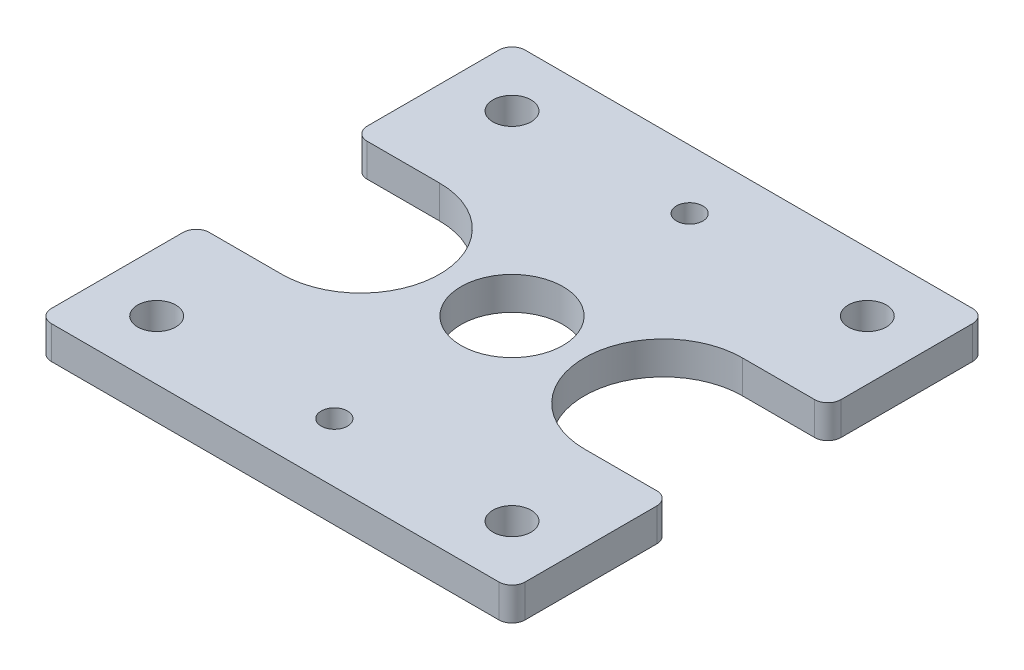
ISO-10303-21;
HEADER;
FILE_DESCRIPTION(('STEP AP214'),'2;1');
FILE_NAME('part.step','',(''),(''),'','','');
FILE_SCHEMA(('AUTOMOTIVE_DESIGN { 1 0 10303 214 1 1 1 1 }'));
ENDSEC;
DATA;
#1=APPLICATION_CONTEXT('core data for automotive mechanical design processes');
#2=APPLICATION_PROTOCOL_DEFINITION('international standard','automotive_design',2000,#1);
#3=PRODUCT_CONTEXT('',#1,'mechanical');
#4=PRODUCT('Part','Part','',(#3));
#5=PRODUCT_RELATED_PRODUCT_CATEGORY('part','',(#4));
#6=PRODUCT_DEFINITION_FORMATION('','',#4);
#7=PRODUCT_DEFINITION_CONTEXT('part definition',#1,'design');
#8=PRODUCT_DEFINITION('design','',#6,#7);
#9=PRODUCT_DEFINITION_SHAPE('','',#8);
#10=(LENGTH_UNIT() NAMED_UNIT(*) SI_UNIT(.MILLI.,.METRE.));
#11=(NAMED_UNIT(*) PLANE_ANGLE_UNIT() SI_UNIT($,.RADIAN.));
#12=(NAMED_UNIT(*) SI_UNIT($,.STERADIAN.) SOLID_ANGLE_UNIT());
#13=UNCERTAINTY_MEASURE_WITH_UNIT(LENGTH_MEASURE(1.E-05),#10,'distance_accuracy_value','');
#14=(GEOMETRIC_REPRESENTATION_CONTEXT(3) GLOBAL_UNCERTAINTY_ASSIGNED_CONTEXT((#13)) GLOBAL_UNIT_ASSIGNED_CONTEXT((#10,
#11,#12)) REPRESENTATION_CONTEXT('',''));
#15=CARTESIAN_POINT('',(0.,0.,0.));
#16=DIRECTION('',(0.,0.,1.));
#17=DIRECTION('',(1.,0.,0.));
#18=AXIS2_PLACEMENT_3D('',#15,#16,#17);
#19=CARTESIAN_POINT('',(-23.,5.,0.));
#20=DIRECTION('',(0.,1.,0.));
#21=DIRECTION('',(0.,0.,1.));
#22=AXIS2_PLACEMENT_3D('',#19,#20,#21);
#23=PLANE('',#22);
#24=CARTESIAN_POINT('',(0.,5.,27.));
#25=DIRECTION('',(0.,1.,0.));
#26=DIRECTION('',(0.,0.,1.));
#27=AXIS2_PLACEMENT_3D('',#24,#25,#26);
#28=CIRCLE('',#27,2.);
#29=CARTESIAN_POINT('',(0.,5.,29.));
#30=VERTEX_POINT('',#29);
#31=EDGE_CURVE('E376',#30,#30,#28,.T.);
#32=ORIENTED_EDGE('',*,*,#31,.F.);
#33=EDGE_LOOP('',(#32));
#34=FACE_BOUND('',#33,.T.);
#35=CARTESIAN_POINT('',(27.,5.,27.));
#36=DIRECTION('',(0.,1.,0.));
#37=DIRECTION('',(0.,0.,1.));
#38=AXIS2_PLACEMENT_3D('',#35,#36,#37);
#39=CIRCLE('',#38,2.9);
#40=CARTESIAN_POINT('',(27.,5.,29.9));
#41=VERTEX_POINT('',#40);
#42=EDGE_CURVE('E364',#41,#41,#39,.T.);
#43=ORIENTED_EDGE('',*,*,#42,.F.);
#44=EDGE_LOOP('',(#43));
#45=FACE_BOUND('',#44,.T.);
#46=CARTESIAN_POINT('',(-27.,5.,-27.));
#47=DIRECTION('',(0.,1.,0.));
#48=DIRECTION('',(0.,0.,1.));
#49=AXIS2_PLACEMENT_3D('',#46,#47,#48);
#50=CIRCLE('',#49,2.9);
#51=CARTESIAN_POINT('',(-27.,5.,-24.1));
#52=VERTEX_POINT('',#51);
#53=EDGE_CURVE('E352',#52,#52,#50,.T.);
#54=ORIENTED_EDGE('',*,*,#53,.F.);
#55=EDGE_LOOP('',(#54));
#56=FACE_BOUND('',#55,.T.);
#57=DIRECTION('',(0.,0.,1.));
#58=VECTOR('',#57,1.);
#59=CARTESIAN_POINT('',(-36.,5.,-12.));
#60=LINE('',#59,#58);
#61=CARTESIAN_POINT('',(-36.,5.,-34.));
#62=VERTEX_POINT('',#61);
#63=CARTESIAN_POINT('',(-36.,5.,-14.));
#64=VERTEX_POINT('',#63);
#65=EDGE_CURVE('E185',#62,#64,#60,.T.);
#66=ORIENTED_EDGE('',*,*,#65,.T.);
#67=CARTESIAN_POINT('',(-34.,5.,-14.));
#68=DIRECTION('',(0.,1.,0.));
#69=DIRECTION('',(0.,0.,1.));
#70=AXIS2_PLACEMENT_3D('',#67,#68,#69);
#71=CIRCLE('',#70,2.);
#72=CARTESIAN_POINT('',(-34.,5.,-12.));
#73=VERTEX_POINT('',#72);
#74=EDGE_CURVE('E181',#64,#73,#71,.T.);
#75=ORIENTED_EDGE('',*,*,#74,.T.);
#76=DIRECTION('',(1.,0.,0.));
#77=VECTOR('',#76,1.);
#78=CARTESIAN_POINT('',(-23.,5.,-12.));
#79=LINE('',#78,#77);
#80=CARTESIAN_POINT('',(-23.,5.,-12.));
#81=VERTEX_POINT('',#80);
#82=EDGE_CURVE('E172',#73,#81,#79,.T.);
#83=ORIENTED_EDGE('',*,*,#82,.T.);
#84=CARTESIAN_POINT('',(-23.,5.,0.));
#85=DIRECTION('',(0.,-1.,0.));
#86=DIRECTION('',(0.,0.,1.));
#87=AXIS2_PLACEMENT_3D('',#84,#85,#86);
#88=CIRCLE('',#87,12.);
#89=CARTESIAN_POINT('',(-23.,5.,12.));
#90=VERTEX_POINT('',#89);
#91=EDGE_CURVE('E178',#81,#90,#88,.T.);
#92=ORIENTED_EDGE('',*,*,#91,.T.);
#93=DIRECTION('',(-1.,0.,0.));
#94=VECTOR('',#93,1.);
#95=CARTESIAN_POINT('',(-23.,5.,12.));
#96=LINE('',#95,#94);
#97=CARTESIAN_POINT('',(-34.,5.,12.));
#98=VERTEX_POINT('',#97);
#99=EDGE_CURVE('E200',#90,#98,#96,.T.);
#100=ORIENTED_EDGE('',*,*,#99,.T.);
#101=CARTESIAN_POINT('',(-34.,5.,14.));
#102=DIRECTION('',(0.,1.,0.));
#103=DIRECTION('',(0.,0.,1.));
#104=AXIS2_PLACEMENT_3D('',#101,#102,#103);
#105=CIRCLE('',#104,2.);
#106=CARTESIAN_POINT('',(-36.,5.,14.));
#107=VERTEX_POINT('',#106);
#108=EDGE_CURVE('E309',#98,#107,#105,.T.);
#109=ORIENTED_EDGE('',*,*,#108,.T.);
#110=DIRECTION('',(0.,0.,1.));
#111=VECTOR('',#110,1.);
#112=CARTESIAN_POINT('',(-36.,5.,36.));
#113=LINE('',#112,#111);
#114=CARTESIAN_POINT('',(-36.,5.,34.));
#115=VERTEX_POINT('',#114);
#116=EDGE_CURVE('E202',#107,#115,#113,.T.);
#117=ORIENTED_EDGE('',*,*,#116,.T.);
#118=CARTESIAN_POINT('',(-34.,5.,34.));
#119=DIRECTION('',(0.,1.,0.));
#120=DIRECTION('',(0.,0.,1.));
#121=AXIS2_PLACEMENT_3D('',#118,#119,#120);
#122=CIRCLE('',#121,2.);
#123=CARTESIAN_POINT('',(-34.,5.,36.));
#124=VERTEX_POINT('',#123);
#125=EDGE_CURVE('E272',#115,#124,#122,.T.);
#126=ORIENTED_EDGE('',*,*,#125,.T.);
#127=DIRECTION('',(1.,0.,0.));
#128=VECTOR('',#127,1.);
#129=CARTESIAN_POINT('',(-36.,5.,36.));
#130=LINE('',#129,#128);
#131=CARTESIAN_POINT('',(34.,5.,36.));
#132=VERTEX_POINT('',#131);
#133=EDGE_CURVE('E207',#124,#132,#130,.T.);
#134=ORIENTED_EDGE('',*,*,#133,.T.);
#135=CARTESIAN_POINT('',(34.,5.,34.));
#136=DIRECTION('',(0.,1.,0.));
#137=DIRECTION('',(0.,0.,1.));
#138=AXIS2_PLACEMENT_3D('',#135,#136,#137);
#139=CIRCLE('',#138,2.);
#140=CARTESIAN_POINT('',(36.,5.,34.));
#141=VERTEX_POINT('',#140);
#142=EDGE_CURVE('E274',#132,#141,#139,.T.);
#143=ORIENTED_EDGE('',*,*,#142,.T.);
#144=DIRECTION('',(0.,0.,-1.));
#145=VECTOR('',#144,1.);
#146=CARTESIAN_POINT('',(36.,5.,36.));
#147=LINE('',#146,#145);
#148=CARTESIAN_POINT('',(36.,5.,14.));
#149=VERTEX_POINT('',#148);
#150=EDGE_CURVE('E210',#141,#149,#147,.T.);
#151=ORIENTED_EDGE('',*,*,#150,.T.);
#152=CARTESIAN_POINT('',(34.,5.,14.));
#153=DIRECTION('',(0.,1.,0.));
#154=DIRECTION('',(0.,0.,1.));
#155=AXIS2_PLACEMENT_3D('',#152,#153,#154);
#156=CIRCLE('',#155,2.);
#157=CARTESIAN_POINT('',(34.,5.,12.));
#158=VERTEX_POINT('',#157);
#159=EDGE_CURVE('E57',#149,#158,#156,.T.);
#160=ORIENTED_EDGE('',*,*,#159,.T.);
#161=DIRECTION('',(-1.,0.,0.));
#162=VECTOR('',#161,1.);
#163=CARTESIAN_POINT('',(23.,5.,12.));
#164=LINE('',#163,#162);
#165=CARTESIAN_POINT('',(23.,5.,12.));
#166=VERTEX_POINT('',#165);
#167=EDGE_CURVE('E212',#158,#166,#164,.T.);
#168=ORIENTED_EDGE('',*,*,#167,.T.);
#169=CARTESIAN_POINT('',(23.,5.,0.));
#170=DIRECTION('',(0.,-1.,0.));
#171=DIRECTION('',(0.,0.,1.));
#172=AXIS2_PLACEMENT_3D('',#169,#170,#171);
#173=CIRCLE('',#172,12.);
#174=CARTESIAN_POINT('',(23.,5.,-12.));
#175=VERTEX_POINT('',#174);
#176=EDGE_CURVE('E214',#166,#175,#173,.T.);
#177=ORIENTED_EDGE('',*,*,#176,.T.);
#178=DIRECTION('',(1.,0.,0.));
#179=VECTOR('',#178,1.);
#180=CARTESIAN_POINT('',(23.,5.,-12.));
#181=LINE('',#180,#179);
#182=CARTESIAN_POINT('',(34.,5.,-12.));
#183=VERTEX_POINT('',#182);
#184=EDGE_CURVE('E216',#175,#183,#181,.T.);
#185=ORIENTED_EDGE('',*,*,#184,.T.);
#186=CARTESIAN_POINT('',(34.,5.,-14.));
#187=DIRECTION('',(0.,1.,0.));
#188=DIRECTION('',(0.,0.,1.));
#189=AXIS2_PLACEMENT_3D('',#186,#187,#188);
#190=CIRCLE('',#189,2.);
#191=CARTESIAN_POINT('',(36.,5.,-14.));
#192=VERTEX_POINT('',#191);
#193=EDGE_CURVE('E306',#183,#192,#190,.T.);
#194=ORIENTED_EDGE('',*,*,#193,.T.);
#195=DIRECTION('',(0.,0.,-1.));
#196=VECTOR('',#195,1.);
#197=CARTESIAN_POINT('',(36.,5.,-12.));
#198=LINE('',#197,#196);
#199=CARTESIAN_POINT('',(36.,5.,-34.));
#200=VERTEX_POINT('',#199);
#201=EDGE_CURVE('E248',#192,#200,#198,.T.);
#202=ORIENTED_EDGE('',*,*,#201,.T.);
#203=CARTESIAN_POINT('',(34.,5.,-34.));
#204=DIRECTION('',(0.,1.,0.));
#205=DIRECTION('',(0.,0.,1.));
#206=AXIS2_PLACEMENT_3D('',#203,#204,#205);
#207=CIRCLE('',#206,2.);
#208=CARTESIAN_POINT('',(34.,5.,-36.));
#209=VERTEX_POINT('',#208);
#210=EDGE_CURVE('E278',#200,#209,#207,.T.);
#211=ORIENTED_EDGE('',*,*,#210,.T.);
#212=DIRECTION('',(-1.,0.,0.));
#213=VECTOR('',#212,1.);
#214=CARTESIAN_POINT('',(-36.,5.,-36.));
#215=LINE('',#214,#213);
#216=CARTESIAN_POINT('',(-34.,5.,-36.));
#217=VERTEX_POINT('',#216);
#218=EDGE_CURVE('E341',#209,#217,#215,.T.);
#219=ORIENTED_EDGE('',*,*,#218,.T.);
#220=CARTESIAN_POINT('',(-34.,5.,-34.));
#221=DIRECTION('',(0.,1.,0.));
#222=DIRECTION('',(0.,0.,1.));
#223=AXIS2_PLACEMENT_3D('',#220,#221,#222);
#224=CIRCLE('',#223,2.);
#225=EDGE_CURVE('E276',#217,#62,#224,.T.);
#226=ORIENTED_EDGE('',*,*,#225,.T.);
#227=EDGE_LOOP('',(#66,#75,#83,#92,#100,#109,#117,#126,#134,#143,#151,#160,#168,#177,#185,#194,
#202,#211,#219,#226));
#228=FACE_BOUND('',#227,.T.);
#229=CARTESIAN_POINT('',(0.,5.,0.));
#230=DIRECTION('',(0.,1.,0.));
#231=DIRECTION('',(0.,0.,1.));
#232=AXIS2_PLACEMENT_3D('',#229,#230,#231);
#233=CIRCLE('',#232,7.75);
#234=CARTESIAN_POINT('',(0.,5.,7.75));
#235=VERTEX_POINT('',#234);
#236=EDGE_CURVE('E222',#235,#235,#233,.T.);
#237=ORIENTED_EDGE('',*,*,#236,.F.);
#238=EDGE_LOOP('',(#237));
#239=FACE_BOUND('',#238,.T.);
#240=CARTESIAN_POINT('',(27.,5.,-27.0000000000001));
#241=DIRECTION('',(0.,1.,0.));
#242=DIRECTION('',(0.,0.,1.));
#243=AXIS2_PLACEMENT_3D('',#240,#241,#242);
#244=CIRCLE('',#243,2.9);
#245=CARTESIAN_POINT('',(27.,5.,-24.1000000000001));
#246=VERTEX_POINT('',#245);
#247=EDGE_CURVE('E358',#246,#246,#244,.T.);
#248=ORIENTED_EDGE('',*,*,#247,.F.);
#249=EDGE_LOOP('',(#248));
#250=FACE_BOUND('',#249,.T.);
#251=CARTESIAN_POINT('',(-27.,5.,27.));
#252=DIRECTION('',(0.,1.,0.));
#253=DIRECTION('',(0.,0.,1.));
#254=AXIS2_PLACEMENT_3D('',#251,#252,#253);
#255=CIRCLE('',#254,2.9);
#256=CARTESIAN_POINT('',(-27.,5.,29.9));
#257=VERTEX_POINT('',#256);
#258=EDGE_CURVE('E370',#257,#257,#255,.T.);
#259=ORIENTED_EDGE('',*,*,#258,.F.);
#260=EDGE_LOOP('',(#259));
#261=FACE_BOUND('',#260,.T.);
#262=CARTESIAN_POINT('',(0.,5.,-27.0000000000001));
#263=DIRECTION('',(0.,1.,0.));
#264=DIRECTION('',(0.,0.,1.));
#265=AXIS2_PLACEMENT_3D('',#262,#263,#264);
#266=CIRCLE('',#265,2.);
#267=CARTESIAN_POINT('',(0.,5.,-25.));
#268=VERTEX_POINT('',#267);
#269=EDGE_CURVE('E382',#268,#268,#266,.T.);
#270=ORIENTED_EDGE('',*,*,#269,.F.);
#271=EDGE_LOOP('',(#270));
#272=FACE_BOUND('',#271,.T.);
#273=ADVANCED_FACE('F36',(#34,#45,#56,#228,#239,#250,#261,#272),#23,.T.);
#274=CARTESIAN_POINT('',(-23.,0.,0.));
#275=DIRECTION('',(0.,1.,0.));
#276=DIRECTION('',(0.,0.,1.));
#277=AXIS2_PLACEMENT_3D('',#274,#275,#276);
#278=PLANE('',#277);
#279=DIRECTION('',(1.,0.,0.));
#280=VECTOR('',#279,1.);
#281=CARTESIAN_POINT('',(-23.,0.,-12.));
#282=LINE('',#281,#280);
#283=CARTESIAN_POINT('',(-34.,0.,-12.));
#284=VERTEX_POINT('',#283);
#285=CARTESIAN_POINT('',(-23.,0.,-12.));
#286=VERTEX_POINT('',#285);
#287=EDGE_CURVE('E191',#284,#286,#282,.T.);
#288=ORIENTED_EDGE('',*,*,#287,.F.);
#289=CARTESIAN_POINT('',(-34.,0.,-14.));
#290=DIRECTION('',(0.,1.,0.));
#291=DIRECTION('',(0.,0.,1.));
#292=AXIS2_PLACEMENT_3D('',#289,#290,#291);
#293=CIRCLE('',#292,2.);
#294=CARTESIAN_POINT('',(-36.,0.,-14.));
#295=VERTEX_POINT('',#294);
#296=EDGE_CURVE('E302',#284,#295,#293,.F.);
#297=ORIENTED_EDGE('',*,*,#296,.T.);
#298=DIRECTION('',(0.,0.,1.));
#299=VECTOR('',#298,1.);
#300=CARTESIAN_POINT('',(-36.,0.,-12.));
#301=LINE('',#300,#299);
#302=CARTESIAN_POINT('',(-36.,0.,-34.));
#303=VERTEX_POINT('',#302);
#304=EDGE_CURVE('E225',#303,#295,#301,.T.);
#305=ORIENTED_EDGE('',*,*,#304,.F.);
#306=CARTESIAN_POINT('',(-34.,0.,-34.));
#307=DIRECTION('',(0.,1.,0.));
#308=DIRECTION('',(0.,0.,1.));
#309=AXIS2_PLACEMENT_3D('',#306,#307,#308);
#310=CIRCLE('',#309,2.);
#311=CARTESIAN_POINT('',(-34.,0.,-36.));
#312=VERTEX_POINT('',#311);
#313=EDGE_CURVE('E264',#303,#312,#310,.F.);
#314=ORIENTED_EDGE('',*,*,#313,.T.);
#315=DIRECTION('',(-1.,0.,0.));
#316=VECTOR('',#315,1.);
#317=CARTESIAN_POINT('',(-36.,0.,-36.));
#318=LINE('',#317,#316);
#319=CARTESIAN_POINT('',(34.,0.,-36.));
#320=VERTEX_POINT('',#319);
#321=EDGE_CURVE('E221',#320,#312,#318,.T.);
#322=ORIENTED_EDGE('',*,*,#321,.F.);
#323=CARTESIAN_POINT('',(34.,0.,-34.));
#324=DIRECTION('',(0.,1.,0.));
#325=DIRECTION('',(0.,0.,1.));
#326=AXIS2_PLACEMENT_3D('',#323,#324,#325);
#327=CIRCLE('',#326,2.);
#328=CARTESIAN_POINT('',(36.,0.,-34.));
#329=VERTEX_POINT('',#328);
#330=EDGE_CURVE('E266',#320,#329,#327,.F.);
#331=ORIENTED_EDGE('',*,*,#330,.T.);
#332=DIRECTION('',(0.,0.,-1.));
#333=VECTOR('',#332,1.);
#334=CARTESIAN_POINT('',(36.,0.,-12.));
#335=LINE('',#334,#333);
#336=CARTESIAN_POINT('',(36.,0.,-14.));
#337=VERTEX_POINT('',#336);
#338=EDGE_CURVE('E219',#337,#329,#335,.T.);
#339=ORIENTED_EDGE('',*,*,#338,.F.);
#340=CARTESIAN_POINT('',(34.,0.,-14.));
#341=DIRECTION('',(0.,1.,0.));
#342=DIRECTION('',(0.,0.,1.));
#343=AXIS2_PLACEMENT_3D('',#340,#341,#342);
#344=CIRCLE('',#343,2.);
#345=CARTESIAN_POINT('',(34.,0.,-12.));
#346=VERTEX_POINT('',#345);
#347=EDGE_CURVE('E296',#337,#346,#344,.F.);
#348=ORIENTED_EDGE('',*,*,#347,.T.);
#349=DIRECTION('',(1.,0.,0.));
#350=VECTOR('',#349,1.);
#351=CARTESIAN_POINT('',(23.,0.,-12.));
#352=LINE('',#351,#350);
#353=CARTESIAN_POINT('',(23.,0.,-12.));
#354=VERTEX_POINT('',#353);
#355=EDGE_CURVE('E246',#354,#346,#352,.T.);
#356=ORIENTED_EDGE('',*,*,#355,.F.);
#357=CARTESIAN_POINT('',(23.,0.,0.));
#358=DIRECTION('',(0.,-1.,0.));
#359=DIRECTION('',(0.,0.,1.));
#360=AXIS2_PLACEMENT_3D('',#357,#358,#359);
#361=CIRCLE('',#360,12.);
#362=CARTESIAN_POINT('',(23.,0.,12.));
#363=VERTEX_POINT('',#362);
#364=EDGE_CURVE('E244',#363,#354,#361,.T.);
#365=ORIENTED_EDGE('',*,*,#364,.F.);
#366=DIRECTION('',(-1.,0.,0.));
#367=VECTOR('',#366,1.);
#368=CARTESIAN_POINT('',(23.,0.,12.));
#369=LINE('',#368,#367);
#370=CARTESIAN_POINT('',(34.,0.,12.));
#371=VERTEX_POINT('',#370);
#372=EDGE_CURVE('E242',#371,#363,#369,.T.);
#373=ORIENTED_EDGE('',*,*,#372,.F.);
#374=CARTESIAN_POINT('',(34.,0.,14.));
#375=DIRECTION('',(0.,1.,0.));
#376=DIRECTION('',(0.,0.,1.));
#377=AXIS2_PLACEMENT_3D('',#374,#375,#376);
#378=CIRCLE('',#377,2.);
#379=CARTESIAN_POINT('',(36.,0.,14.));
#380=VERTEX_POINT('',#379);
#381=EDGE_CURVE('E298',#371,#380,#378,.F.);
#382=ORIENTED_EDGE('',*,*,#381,.T.);
#383=DIRECTION('',(0.,0.,-1.));
#384=VECTOR('',#383,1.);
#385=CARTESIAN_POINT('',(36.,0.,36.));
#386=LINE('',#385,#384);
#387=CARTESIAN_POINT('',(36.,0.,34.));
#388=VERTEX_POINT('',#387);
#389=EDGE_CURVE('E239',#388,#380,#386,.T.);
#390=ORIENTED_EDGE('',*,*,#389,.F.);
#391=CARTESIAN_POINT('',(34.,0.,34.));
#392=DIRECTION('',(0.,1.,0.));
#393=DIRECTION('',(0.,0.,1.));
#394=AXIS2_PLACEMENT_3D('',#391,#392,#393);
#395=CIRCLE('',#394,2.);
#396=CARTESIAN_POINT('',(34.,0.,36.));
#397=VERTEX_POINT('',#396);
#398=EDGE_CURVE('E262',#388,#397,#395,.F.);
#399=ORIENTED_EDGE('',*,*,#398,.T.);
#400=DIRECTION('',(1.,0.,0.));
#401=VECTOR('',#400,1.);
#402=CARTESIAN_POINT('',(-36.,0.,36.));
#403=LINE('',#402,#401);
#404=CARTESIAN_POINT('',(-34.,0.,36.));
#405=VERTEX_POINT('',#404);
#406=EDGE_CURVE('E236',#405,#397,#403,.T.);
#407=ORIENTED_EDGE('',*,*,#406,.F.);
#408=CARTESIAN_POINT('',(-34.,0.,34.));
#409=DIRECTION('',(0.,1.,0.));
#410=DIRECTION('',(0.,0.,1.));
#411=AXIS2_PLACEMENT_3D('',#408,#409,#410);
#412=CIRCLE('',#411,2.);
#413=CARTESIAN_POINT('',(-36.,0.,34.));
#414=VERTEX_POINT('',#413);
#415=EDGE_CURVE('E259',#405,#414,#412,.F.);
#416=ORIENTED_EDGE('',*,*,#415,.T.);
#417=DIRECTION('',(0.,0.,1.));
#418=VECTOR('',#417,1.);
#419=CARTESIAN_POINT('',(-36.,0.,36.));
#420=LINE('',#419,#418);
#421=CARTESIAN_POINT('',(-36.,0.,14.));
#422=VERTEX_POINT('',#421);
#423=EDGE_CURVE('E234',#422,#414,#420,.T.);
#424=ORIENTED_EDGE('',*,*,#423,.F.);
#425=CARTESIAN_POINT('',(-34.,0.,14.));
#426=DIRECTION('',(0.,1.,0.));
#427=DIRECTION('',(0.,0.,1.));
#428=AXIS2_PLACEMENT_3D('',#425,#426,#427);
#429=CIRCLE('',#428,2.);
#430=CARTESIAN_POINT('',(-34.,0.,12.));
#431=VERTEX_POINT('',#430);
#432=EDGE_CURVE('E300',#422,#431,#429,.F.);
#433=ORIENTED_EDGE('',*,*,#432,.T.);
#434=DIRECTION('',(-1.,0.,0.));
#435=VECTOR('',#434,1.);
#436=CARTESIAN_POINT('',(-23.,0.,12.));
#437=LINE('',#436,#435);
#438=CARTESIAN_POINT('',(-23.,0.,12.));
#439=VERTEX_POINT('',#438);
#440=EDGE_CURVE('E231',#439,#431,#437,.T.);
#441=ORIENTED_EDGE('',*,*,#440,.F.);
#442=CARTESIAN_POINT('',(-23.,0.,0.));
#443=DIRECTION('',(0.,-1.,0.));
#444=DIRECTION('',(0.,0.,1.));
#445=AXIS2_PLACEMENT_3D('',#442,#443,#444);
#446=CIRCLE('',#445,12.);
#447=EDGE_CURVE('E229',#286,#439,#446,.T.);
#448=ORIENTED_EDGE('',*,*,#447,.F.);
#449=EDGE_LOOP('',(#288,#297,#305,#314,#322,#331,#339,#348,#356,#365,#373,#382,#390,#399,#407,
#416,#424,#433,#441,#448));
#450=FACE_BOUND('',#449,.T.);
#451=CARTESIAN_POINT('',(0.,0.,0.));
#452=DIRECTION('',(0.,1.,0.));
#453=DIRECTION('',(0.,0.,1.));
#454=AXIS2_PLACEMENT_3D('',#451,#452,#453);
#455=CIRCLE('',#454,7.75);
#456=CARTESIAN_POINT('',(0.,0.,7.75));
#457=VERTEX_POINT('',#456);
#458=EDGE_CURVE('E349',#457,#457,#455,.T.);
#459=ORIENTED_EDGE('',*,*,#458,.T.);
#460=EDGE_LOOP('',(#459));
#461=FACE_BOUND('',#460,.T.);
#462=CARTESIAN_POINT('',(-27.,0.,-27.));
#463=DIRECTION('',(0.,1.,0.));
#464=DIRECTION('',(0.,0.,1.));
#465=AXIS2_PLACEMENT_3D('',#462,#463,#464);
#466=CIRCLE('',#465,2.9);
#467=CARTESIAN_POINT('',(-27.,0.,-24.1));
#468=VERTEX_POINT('',#467);
#469=EDGE_CURVE('E355',#468,#468,#466,.T.);
#470=ORIENTED_EDGE('',*,*,#469,.T.);
#471=EDGE_LOOP('',(#470));
#472=FACE_BOUND('',#471,.T.);
#473=CARTESIAN_POINT('',(27.,0.,-27.0000000000001));
#474=DIRECTION('',(0.,1.,0.));
#475=DIRECTION('',(0.,0.,1.));
#476=AXIS2_PLACEMENT_3D('',#473,#474,#475);
#477=CIRCLE('',#476,2.9);
#478=CARTESIAN_POINT('',(27.,0.,-24.1000000000001));
#479=VERTEX_POINT('',#478);
#480=EDGE_CURVE('E361',#479,#479,#477,.T.);
#481=ORIENTED_EDGE('',*,*,#480,.T.);
#482=EDGE_LOOP('',(#481));
#483=FACE_BOUND('',#482,.T.);
#484=CARTESIAN_POINT('',(27.,0.,27.));
#485=DIRECTION('',(0.,1.,0.));
#486=DIRECTION('',(0.,0.,1.));
#487=AXIS2_PLACEMENT_3D('',#484,#485,#486);
#488=CIRCLE('',#487,2.9);
#489=CARTESIAN_POINT('',(27.,0.,29.9));
#490=VERTEX_POINT('',#489);
#491=EDGE_CURVE('E367',#490,#490,#488,.T.);
#492=ORIENTED_EDGE('',*,*,#491,.T.);
#493=EDGE_LOOP('',(#492));
#494=FACE_BOUND('',#493,.T.);
#495=CARTESIAN_POINT('',(-27.,0.,27.));
#496=DIRECTION('',(0.,1.,0.));
#497=DIRECTION('',(0.,0.,1.));
#498=AXIS2_PLACEMENT_3D('',#495,#496,#497);
#499=CIRCLE('',#498,2.9);
#500=CARTESIAN_POINT('',(-27.,0.,29.9));
#501=VERTEX_POINT('',#500);
#502=EDGE_CURVE('E373',#501,#501,#499,.T.);
#503=ORIENTED_EDGE('',*,*,#502,.T.);
#504=EDGE_LOOP('',(#503));
#505=FACE_BOUND('',#504,.T.);
#506=CARTESIAN_POINT('',(0.,0.,27.));
#507=DIRECTION('',(0.,1.,0.));
#508=DIRECTION('',(0.,0.,1.));
#509=AXIS2_PLACEMENT_3D('',#506,#507,#508);
#510=CIRCLE('',#509,2.);
#511=CARTESIAN_POINT('',(0.,0.,29.));
#512=VERTEX_POINT('',#511);
#513=EDGE_CURVE('E379',#512,#512,#510,.T.);
#514=ORIENTED_EDGE('',*,*,#513,.T.);
#515=EDGE_LOOP('',(#514));
#516=FACE_BOUND('',#515,.T.);
#517=CARTESIAN_POINT('',(0.,0.,-27.0000000000001));
#518=DIRECTION('',(0.,1.,0.));
#519=DIRECTION('',(0.,0.,1.));
#520=AXIS2_PLACEMENT_3D('',#517,#518,#519);
#521=CIRCLE('',#520,2.);
#522=CARTESIAN_POINT('',(0.,0.,-25.));
#523=VERTEX_POINT('',#522);
#524=EDGE_CURVE('E385',#523,#523,#521,.T.);
#525=ORIENTED_EDGE('',*,*,#524,.T.);
#526=EDGE_LOOP('',(#525));
#527=FACE_BOUND('',#526,.T.);
#528=ADVANCED_FACE('F330',(#450,#461,#472,#483,#494,#505,#516,#527),#278,.F.);
#529=CARTESIAN_POINT('',(36.,5.,-12.));
#530=DIRECTION('',(-1.,0.,0.));
#531=DIRECTION('',(0.,0.,1.));
#532=AXIS2_PLACEMENT_3D('',#529,#530,#531);
#533=PLANE('',#532);
#534=ORIENTED_EDGE('',*,*,#201,.F.);
#535=DIRECTION('',(0.,-1.,0.));
#536=VECTOR('',#535,1.);
#537=CARTESIAN_POINT('',(36.,5.,-14.));
#538=LINE('',#537,#536);
#539=EDGE_CURVE('E44',#192,#337,#538,.T.);
#540=ORIENTED_EDGE('',*,*,#539,.T.);
#541=ORIENTED_EDGE('',*,*,#338,.T.);
#542=DIRECTION('',(0.,-1.,0.));
#543=VECTOR('',#542,1.);
#544=CARTESIAN_POINT('',(36.,5.,-34.));
#545=LINE('',#544,#543);
#546=EDGE_CURVE('E269',#329,#200,#545,.F.);
#547=ORIENTED_EDGE('',*,*,#546,.T.);
#548=EDGE_LOOP('',(#534,#540,#541,#547));
#549=FACE_BOUND('',#548,.T.);
#550=ADVANCED_FACE('F326',(#549),#533,.F.);
#551=CARTESIAN_POINT('',(-36.,5.,-36.));
#552=DIRECTION('',(0.,0.,1.));
#553=DIRECTION('',(1.,0.,0.));
#554=AXIS2_PLACEMENT_3D('',#551,#552,#553);
#555=PLANE('',#554);
#556=ORIENTED_EDGE('',*,*,#218,.F.);
#557=DIRECTION('',(0.,-1.,0.));
#558=VECTOR('',#557,1.);
#559=CARTESIAN_POINT('',(34.,5.,-36.));
#560=LINE('',#559,#558);
#561=EDGE_CURVE('E256',#209,#320,#560,.T.);
#562=ORIENTED_EDGE('',*,*,#561,.T.);
#563=ORIENTED_EDGE('',*,*,#321,.T.);
#564=DIRECTION('',(0.,-1.,0.));
#565=VECTOR('',#564,1.);
#566=CARTESIAN_POINT('',(-34.,5.,-36.));
#567=LINE('',#566,#565);
#568=EDGE_CURVE('E194',#312,#217,#567,.F.);
#569=ORIENTED_EDGE('',*,*,#568,.T.);
#570=EDGE_LOOP('',(#556,#562,#563,#569));
#571=FACE_BOUND('',#570,.T.);
#572=ADVANCED_FACE('F344',(#571),#555,.F.);
#573=CARTESIAN_POINT('',(-36.,5.,-12.));
#574=DIRECTION('',(1.,0.,0.));
#575=DIRECTION('',(0.,0.,-1.));
#576=AXIS2_PLACEMENT_3D('',#573,#574,#575);
#577=PLANE('',#576);
#578=ORIENTED_EDGE('',*,*,#304,.T.);
#579=DIRECTION('',(0.,-1.,0.));
#580=VECTOR('',#579,1.);
#581=CARTESIAN_POINT('',(-36.,5.,-14.));
#582=LINE('',#581,#580);
#583=EDGE_CURVE('E304',#295,#64,#582,.F.);
#584=ORIENTED_EDGE('',*,*,#583,.T.);
#585=ORIENTED_EDGE('',*,*,#65,.F.);
#586=DIRECTION('',(0.,-1.,0.));
#587=VECTOR('',#586,1.);
#588=CARTESIAN_POINT('',(-36.,5.,-34.));
#589=LINE('',#588,#587);
#590=EDGE_CURVE('E280',#62,#303,#589,.T.);
#591=ORIENTED_EDGE('',*,*,#590,.T.);
#592=EDGE_LOOP('',(#578,#584,#585,#591));
#593=FACE_BOUND('',#592,.T.);
#594=ADVANCED_FACE('F438',(#593),#577,.F.);
#595=CARTESIAN_POINT('',(-23.,5.,-12.));
#596=DIRECTION('',(0.,0.,-1.));
#597=DIRECTION('',(-1.,0.,0.));
#598=AXIS2_PLACEMENT_3D('',#595,#596,#597);
#599=PLANE('',#598);
#600=ORIENTED_EDGE('',*,*,#82,.F.);
#601=DIRECTION('',(0.,-1.,0.));
#602=VECTOR('',#601,1.);
#603=CARTESIAN_POINT('',(-34.,5.,-12.));
#604=LINE('',#603,#602);
#605=EDGE_CURVE('E294',#73,#284,#604,.T.);
#606=ORIENTED_EDGE('',*,*,#605,.T.);
#607=ORIENTED_EDGE('',*,*,#287,.T.);
#608=DIRECTION('',(0.,-1.,0.));
#609=VECTOR('',#608,1.);
#610=CARTESIAN_POINT('',(-23.,5.,-12.));
#611=LINE('',#610,#609);
#612=EDGE_CURVE('E188',#81,#286,#611,.T.);
#613=ORIENTED_EDGE('',*,*,#612,.F.);
#614=EDGE_LOOP('',(#600,#606,#607,#613));
#615=FACE_BOUND('',#614,.T.);
#616=ADVANCED_FACE('F189',(#615),#599,.F.);
#617=CARTESIAN_POINT('',(-23.,5.,0.));
#618=DIRECTION('',(0.,-1.,0.));
#619=DIRECTION('',(0.,0.,-1.));
#620=AXIS2_PLACEMENT_3D('',#617,#618,#619);
#621=CYLINDRICAL_SURFACE('',#620,12.);
#622=ORIENTED_EDGE('',*,*,#447,.T.);
#623=DIRECTION('',(0.,-1.,0.));
#624=VECTOR('',#623,1.);
#625=CARTESIAN_POINT('',(-23.,5.,12.));
#626=LINE('',#625,#624);
#627=EDGE_CURVE('E195',#90,#439,#626,.T.);
#628=ORIENTED_EDGE('',*,*,#627,.F.);
#629=ORIENTED_EDGE('',*,*,#91,.F.);
#630=ORIENTED_EDGE('',*,*,#612,.T.);
#631=EDGE_LOOP('',(#622,#628,#629,#630));
#632=FACE_BOUND('',#631,.T.);
#633=ADVANCED_FACE('F197',(#632),#621,.F.);
#634=CARTESIAN_POINT('',(-23.,5.,12.));
#635=DIRECTION('',(0.,0.,1.));
#636=DIRECTION('',(1.,0.,0.));
#637=AXIS2_PLACEMENT_3D('',#634,#635,#636);
#638=PLANE('',#637);
#639=ORIENTED_EDGE('',*,*,#440,.T.);
#640=DIRECTION('',(0.,-1.,0.));
#641=VECTOR('',#640,1.);
#642=CARTESIAN_POINT('',(-34.,5.,12.));
#643=LINE('',#642,#641);
#644=EDGE_CURVE('E315',#431,#98,#643,.F.);
#645=ORIENTED_EDGE('',*,*,#644,.T.);
#646=ORIENTED_EDGE('',*,*,#99,.F.);
#647=ORIENTED_EDGE('',*,*,#627,.T.);
#648=EDGE_LOOP('',(#639,#645,#646,#647));
#649=FACE_BOUND('',#648,.T.);
#650=ADVANCED_FACE('F429',(#649),#638,.F.);
#651=CARTESIAN_POINT('',(-36.,5.,36.));
#652=DIRECTION('',(1.,0.,0.));
#653=DIRECTION('',(0.,0.,-1.));
#654=AXIS2_PLACEMENT_3D('',#651,#652,#653);
#655=PLANE('',#654);
#656=ORIENTED_EDGE('',*,*,#116,.F.);
#657=DIRECTION('',(0.,-1.,0.));
#658=VECTOR('',#657,1.);
#659=CARTESIAN_POINT('',(-36.,5.,14.));
#660=LINE('',#659,#658);
#661=EDGE_CURVE('E312',#107,#422,#660,.T.);
#662=ORIENTED_EDGE('',*,*,#661,.T.);
#663=ORIENTED_EDGE('',*,*,#423,.T.);
#664=DIRECTION('',(0.,-1.,0.));
#665=VECTOR('',#664,1.);
#666=CARTESIAN_POINT('',(-36.,5.,34.));
#667=LINE('',#666,#665);
#668=EDGE_CURVE('E291',#414,#115,#667,.F.);
#669=ORIENTED_EDGE('',*,*,#668,.T.);
#670=EDGE_LOOP('',(#656,#662,#663,#669));
#671=FACE_BOUND('',#670,.T.);
#672=ADVANCED_FACE('F425',(#671),#655,.F.);
#673=CARTESIAN_POINT('',(-36.,5.,36.));
#674=DIRECTION('',(0.,0.,-1.));
#675=DIRECTION('',(-1.,0.,0.));
#676=AXIS2_PLACEMENT_3D('',#673,#674,#675);
#677=PLANE('',#676);
#678=ORIENTED_EDGE('',*,*,#406,.T.);
#679=DIRECTION('',(0.,-1.,0.));
#680=VECTOR('',#679,1.);
#681=CARTESIAN_POINT('',(34.,5.,36.));
#682=LINE('',#681,#680);
#683=EDGE_CURVE('E289',#397,#132,#682,.F.);
#684=ORIENTED_EDGE('',*,*,#683,.T.);
#685=ORIENTED_EDGE('',*,*,#133,.F.);
#686=DIRECTION('',(0.,-1.,0.));
#687=VECTOR('',#686,1.);
#688=CARTESIAN_POINT('',(-34.,5.,36.));
#689=LINE('',#688,#687);
#690=EDGE_CURVE('E286',#124,#405,#689,.T.);
#691=ORIENTED_EDGE('',*,*,#690,.T.);
#692=EDGE_LOOP('',(#678,#684,#685,#691));
#693=FACE_BOUND('',#692,.T.);
#694=ADVANCED_FACE('F421',(#693),#677,.F.);
#695=CARTESIAN_POINT('',(36.,5.,36.));
#696=DIRECTION('',(-1.,0.,0.));
#697=DIRECTION('',(0.,0.,1.));
#698=AXIS2_PLACEMENT_3D('',#695,#696,#697);
#699=PLANE('',#698);
#700=ORIENTED_EDGE('',*,*,#389,.T.);
#701=DIRECTION('',(0.,-1.,0.));
#702=VECTOR('',#701,1.);
#703=CARTESIAN_POINT('',(36.,5.,14.));
#704=LINE('',#703,#702);
#705=EDGE_CURVE('E320',#380,#149,#704,.F.);
#706=ORIENTED_EDGE('',*,*,#705,.T.);
#707=ORIENTED_EDGE('',*,*,#150,.F.);
#708=DIRECTION('',(0.,-1.,0.));
#709=VECTOR('',#708,1.);
#710=CARTESIAN_POINT('',(36.,5.,34.));
#711=LINE('',#710,#709);
#712=EDGE_CURVE('E283',#141,#388,#711,.T.);
#713=ORIENTED_EDGE('',*,*,#712,.T.);
#714=EDGE_LOOP('',(#700,#706,#707,#713));
#715=FACE_BOUND('',#714,.T.);
#716=ADVANCED_FACE('F417',(#715),#699,.F.);
#717=CARTESIAN_POINT('',(23.,5.,12.));
#718=DIRECTION('',(0.,0.,1.));
#719=DIRECTION('',(1.,0.,0.));
#720=AXIS2_PLACEMENT_3D('',#717,#718,#719);
#721=PLANE('',#720);
#722=ORIENTED_EDGE('',*,*,#167,.F.);
#723=DIRECTION('',(0.,-1.,0.));
#724=VECTOR('',#723,1.);
#725=CARTESIAN_POINT('',(34.,5.,12.));
#726=LINE('',#725,#724);
#727=EDGE_CURVE('E317',#158,#371,#726,.T.);
#728=ORIENTED_EDGE('',*,*,#727,.T.);
#729=ORIENTED_EDGE('',*,*,#372,.T.);
#730=DIRECTION('',(0.,-1.,0.));
#731=VECTOR('',#730,1.);
#732=CARTESIAN_POINT('',(23.,5.,12.));
#733=LINE('',#732,#731);
#734=EDGE_CURVE('E251',#166,#363,#733,.T.);
#735=ORIENTED_EDGE('',*,*,#734,.F.);
#736=EDGE_LOOP('',(#722,#728,#729,#735));
#737=FACE_BOUND('',#736,.T.);
#738=ADVANCED_FACE('F413',(#737),#721,.F.);
#739=CARTESIAN_POINT('',(23.,5.,0.));
#740=DIRECTION('',(0.,-1.,0.));
#741=DIRECTION('',(0.,0.,-1.));
#742=AXIS2_PLACEMENT_3D('',#739,#740,#741);
#743=CYLINDRICAL_SURFACE('',#742,12.);
#744=ORIENTED_EDGE('',*,*,#364,.T.);
#745=DIRECTION('',(0.,-1.,0.));
#746=VECTOR('',#745,1.);
#747=CARTESIAN_POINT('',(23.,5.,-12.));
#748=LINE('',#747,#746);
#749=EDGE_CURVE('E218',#175,#354,#748,.T.);
#750=ORIENTED_EDGE('',*,*,#749,.F.);
#751=ORIENTED_EDGE('',*,*,#176,.F.);
#752=ORIENTED_EDGE('',*,*,#734,.T.);
#753=EDGE_LOOP('',(#744,#750,#751,#752));
#754=FACE_BOUND('',#753,.T.);
#755=ADVANCED_FACE('F410',(#754),#743,.F.);
#756=CARTESIAN_POINT('',(23.,5.,-12.));
#757=DIRECTION('',(0.,0.,-1.));
#758=DIRECTION('',(-1.,0.,0.));
#759=AXIS2_PLACEMENT_3D('',#756,#757,#758);
#760=PLANE('',#759);
#761=ORIENTED_EDGE('',*,*,#355,.T.);
#762=DIRECTION('',(0.,-1.,0.));
#763=VECTOR('',#762,1.);
#764=CARTESIAN_POINT('',(34.,5.,-12.));
#765=LINE('',#764,#763);
#766=EDGE_CURVE('E11',#346,#183,#765,.F.);
#767=ORIENTED_EDGE('',*,*,#766,.T.);
#768=ORIENTED_EDGE('',*,*,#184,.F.);
#769=ORIENTED_EDGE('',*,*,#749,.T.);
#770=EDGE_LOOP('',(#761,#767,#768,#769));
#771=FACE_BOUND('',#770,.T.);
#772=ADVANCED_FACE('F407',(#771),#760,.F.);
#773=CARTESIAN_POINT('',(0.,5.,0.));
#774=DIRECTION('',(0.,-1.,0.));
#775=DIRECTION('',(0.,0.,-1.));
#776=AXIS2_PLACEMENT_3D('',#773,#774,#775);
#777=CYLINDRICAL_SURFACE('',#776,7.75);
#778=ORIENTED_EDGE('',*,*,#236,.T.);
#779=EDGE_LOOP('',(#778));
#780=FACE_BOUND('',#779,.T.);
#781=ORIENTED_EDGE('',*,*,#458,.F.);
#782=EDGE_LOOP('',(#781));
#783=FACE_BOUND('',#782,.T.);
#784=ADVANCED_FACE('F404',(#780,#783),#777,.F.);
#785=CARTESIAN_POINT('',(-27.,5.,-27.));
#786=DIRECTION('',(0.,-1.,0.));
#787=DIRECTION('',(0.,0.,-1.));
#788=AXIS2_PLACEMENT_3D('',#785,#786,#787);
#789=CYLINDRICAL_SURFACE('',#788,2.9);
#790=ORIENTED_EDGE('',*,*,#53,.T.);
#791=EDGE_LOOP('',(#790));
#792=FACE_BOUND('',#791,.T.);
#793=ORIENTED_EDGE('',*,*,#469,.F.);
#794=EDGE_LOOP('',(#793));
#795=FACE_BOUND('',#794,.T.);
#796=ADVANCED_FACE('F667',(#792,#795),#789,.F.);
#797=CARTESIAN_POINT('',(27.,5.,-27.0000000000001));
#798=DIRECTION('',(0.,-1.,0.));
#799=DIRECTION('',(0.,0.,-1.));
#800=AXIS2_PLACEMENT_3D('',#797,#798,#799);
#801=CYLINDRICAL_SURFACE('',#800,2.9);
#802=ORIENTED_EDGE('',*,*,#247,.T.);
#803=EDGE_LOOP('',(#802));
#804=FACE_BOUND('',#803,.T.);
#805=ORIENTED_EDGE('',*,*,#480,.F.);
#806=EDGE_LOOP('',(#805));
#807=FACE_BOUND('',#806,.T.);
#808=ADVANCED_FACE('F657',(#804,#807),#801,.F.);
#809=CARTESIAN_POINT('',(27.,5.,27.));
#810=DIRECTION('',(0.,-1.,0.));
#811=DIRECTION('',(0.,0.,-1.));
#812=AXIS2_PLACEMENT_3D('',#809,#810,#811);
#813=CYLINDRICAL_SURFACE('',#812,2.9);
#814=ORIENTED_EDGE('',*,*,#42,.T.);
#815=EDGE_LOOP('',(#814));
#816=FACE_BOUND('',#815,.T.);
#817=ORIENTED_EDGE('',*,*,#491,.F.);
#818=EDGE_LOOP('',(#817));
#819=FACE_BOUND('',#818,.T.);
#820=ADVANCED_FACE('F647',(#816,#819),#813,.F.);
#821=CARTESIAN_POINT('',(-27.,5.,27.));
#822=DIRECTION('',(0.,-1.,0.));
#823=DIRECTION('',(0.,0.,-1.));
#824=AXIS2_PLACEMENT_3D('',#821,#822,#823);
#825=CYLINDRICAL_SURFACE('',#824,2.9);
#826=ORIENTED_EDGE('',*,*,#258,.T.);
#827=EDGE_LOOP('',(#826));
#828=FACE_BOUND('',#827,.T.);
#829=ORIENTED_EDGE('',*,*,#502,.F.);
#830=EDGE_LOOP('',(#829));
#831=FACE_BOUND('',#830,.T.);
#832=ADVANCED_FACE('F637',(#828,#831),#825,.F.);
#833=CARTESIAN_POINT('',(0.,5.,27.));
#834=DIRECTION('',(0.,-1.,0.));
#835=DIRECTION('',(0.,0.,-1.));
#836=AXIS2_PLACEMENT_3D('',#833,#834,#835);
#837=CYLINDRICAL_SURFACE('',#836,2.);
#838=ORIENTED_EDGE('',*,*,#31,.T.);
#839=EDGE_LOOP('',(#838));
#840=FACE_BOUND('',#839,.T.);
#841=ORIENTED_EDGE('',*,*,#513,.F.);
#842=EDGE_LOOP('',(#841));
#843=FACE_BOUND('',#842,.T.);
#844=ADVANCED_FACE('F628',(#840,#843),#837,.F.);
#845=CARTESIAN_POINT('',(0.,5.,-27.0000000000001));
#846=DIRECTION('',(0.,-1.,0.));
#847=DIRECTION('',(0.,0.,-1.));
#848=AXIS2_PLACEMENT_3D('',#845,#846,#847);
#849=CYLINDRICAL_SURFACE('',#848,2.);
#850=ORIENTED_EDGE('',*,*,#269,.T.);
#851=EDGE_LOOP('',(#850));
#852=FACE_BOUND('',#851,.T.);
#853=ORIENTED_EDGE('',*,*,#524,.F.);
#854=EDGE_LOOP('',(#853));
#855=FACE_BOUND('',#854,.T.);
#856=ADVANCED_FACE('F391',(#852,#855),#849,.F.);
#857=CARTESIAN_POINT('',(34.,5.,-34.));
#858=DIRECTION('',(0.,-1.,0.));
#859=DIRECTION('',(0.,0.,-1.));
#860=AXIS2_PLACEMENT_3D('',#857,#858,#859);
#861=CYLINDRICAL_SURFACE('',#860,2.);
#862=ORIENTED_EDGE('',*,*,#210,.F.);
#863=ORIENTED_EDGE('',*,*,#546,.F.);
#864=ORIENTED_EDGE('',*,*,#330,.F.);
#865=ORIENTED_EDGE('',*,*,#561,.F.);
#866=EDGE_LOOP('',(#862,#863,#864,#865));
#867=FACE_BOUND('',#866,.T.);
#868=ADVANCED_FACE('F338',(#867),#861,.T.);
#869=CARTESIAN_POINT('',(-34.,5.,-34.));
#870=DIRECTION('',(0.,-1.,0.));
#871=DIRECTION('',(0.,0.,-1.));
#872=AXIS2_PLACEMENT_3D('',#869,#870,#871);
#873=CYLINDRICAL_SURFACE('',#872,2.);
#874=ORIENTED_EDGE('',*,*,#225,.F.);
#875=ORIENTED_EDGE('',*,*,#568,.F.);
#876=ORIENTED_EDGE('',*,*,#313,.F.);
#877=ORIENTED_EDGE('',*,*,#590,.F.);
#878=EDGE_LOOP('',(#874,#875,#876,#877));
#879=FACE_BOUND('',#878,.T.);
#880=ADVANCED_FACE('F448',(#879),#873,.T.);
#881=CARTESIAN_POINT('',(34.,5.,34.));
#882=DIRECTION('',(0.,-1.,0.));
#883=DIRECTION('',(0.,0.,-1.));
#884=AXIS2_PLACEMENT_3D('',#881,#882,#883);
#885=CYLINDRICAL_SURFACE('',#884,2.);
#886=ORIENTED_EDGE('',*,*,#142,.F.);
#887=ORIENTED_EDGE('',*,*,#683,.F.);
#888=ORIENTED_EDGE('',*,*,#398,.F.);
#889=ORIENTED_EDGE('',*,*,#712,.F.);
#890=EDGE_LOOP('',(#886,#887,#888,#889));
#891=FACE_BOUND('',#890,.T.);
#892=ADVANCED_FACE('F451',(#891),#885,.T.);
#893=CARTESIAN_POINT('',(-34.,5.,34.));
#894=DIRECTION('',(0.,-1.,0.));
#895=DIRECTION('',(0.,0.,-1.));
#896=AXIS2_PLACEMENT_3D('',#893,#894,#895);
#897=CYLINDRICAL_SURFACE('',#896,2.);
#898=ORIENTED_EDGE('',*,*,#125,.F.);
#899=ORIENTED_EDGE('',*,*,#668,.F.);
#900=ORIENTED_EDGE('',*,*,#415,.F.);
#901=ORIENTED_EDGE('',*,*,#690,.F.);
#902=EDGE_LOOP('',(#898,#899,#900,#901));
#903=FACE_BOUND('',#902,.T.);
#904=ADVANCED_FACE('F455',(#903),#897,.T.);
#905=CARTESIAN_POINT('',(-34.,5.,-14.));
#906=DIRECTION('',(0.,-1.,0.));
#907=DIRECTION('',(0.,0.,-1.));
#908=AXIS2_PLACEMENT_3D('',#905,#906,#907);
#909=CYLINDRICAL_SURFACE('',#908,2.);
#910=ORIENTED_EDGE('',*,*,#74,.F.);
#911=ORIENTED_EDGE('',*,*,#583,.F.);
#912=ORIENTED_EDGE('',*,*,#296,.F.);
#913=ORIENTED_EDGE('',*,*,#605,.F.);
#914=EDGE_LOOP('',(#910,#911,#912,#913));
#915=FACE_BOUND('',#914,.T.);
#916=ADVANCED_FACE('F459',(#915),#909,.T.);
#917=CARTESIAN_POINT('',(-34.,5.,14.));
#918=DIRECTION('',(0.,-1.,0.));
#919=DIRECTION('',(0.,0.,-1.));
#920=AXIS2_PLACEMENT_3D('',#917,#918,#919);
#921=CYLINDRICAL_SURFACE('',#920,2.);
#922=ORIENTED_EDGE('',*,*,#108,.F.);
#923=ORIENTED_EDGE('',*,*,#644,.F.);
#924=ORIENTED_EDGE('',*,*,#432,.F.);
#925=ORIENTED_EDGE('',*,*,#661,.F.);
#926=EDGE_LOOP('',(#922,#923,#924,#925));
#927=FACE_BOUND('',#926,.T.);
#928=ADVANCED_FACE('F463',(#927),#921,.T.);
#929=CARTESIAN_POINT('',(34.,5.,14.));
#930=DIRECTION('',(0.,-1.,0.));
#931=DIRECTION('',(0.,0.,-1.));
#932=AXIS2_PLACEMENT_3D('',#929,#930,#931);
#933=CYLINDRICAL_SURFACE('',#932,2.);
#934=ORIENTED_EDGE('',*,*,#159,.F.);
#935=ORIENTED_EDGE('',*,*,#705,.F.);
#936=ORIENTED_EDGE('',*,*,#381,.F.);
#937=ORIENTED_EDGE('',*,*,#727,.F.);
#938=EDGE_LOOP('',(#934,#935,#936,#937));
#939=FACE_BOUND('',#938,.T.);
#940=ADVANCED_FACE('F466',(#939),#933,.T.);
#941=CARTESIAN_POINT('',(34.,5.,-14.));
#942=DIRECTION('',(0.,-1.,0.));
#943=DIRECTION('',(0.,0.,-1.));
#944=AXIS2_PLACEMENT_3D('',#941,#942,#943);
#945=CYLINDRICAL_SURFACE('',#944,2.);
#946=ORIENTED_EDGE('',*,*,#193,.F.);
#947=ORIENTED_EDGE('',*,*,#766,.F.);
#948=ORIENTED_EDGE('',*,*,#347,.F.);
#949=ORIENTED_EDGE('',*,*,#539,.F.);
#950=EDGE_LOOP('',(#946,#947,#948,#949));
#951=FACE_BOUND('',#950,.T.);
#952=ADVANCED_FACE('F38',(#951),#945,.T.);
#953=CLOSED_SHELL('',(#273,#528,#550,#572,#594,#616,#633,#650,#672,#694,#716,#738,#755,#772,
#784,#796,#808,#820,#832,#844,#856,#868,#880,#892,#904,#916,#928,#940,#952));
#954=MANIFOLD_SOLID_BREP('B2',#953);
#955=ADVANCED_BREP_SHAPE_REPRESENTATION('',(#18,#954),#14);
#956=SHAPE_DEFINITION_REPRESENTATION(#9,#955);
ENDSEC;
END-ISO-10303-21;
